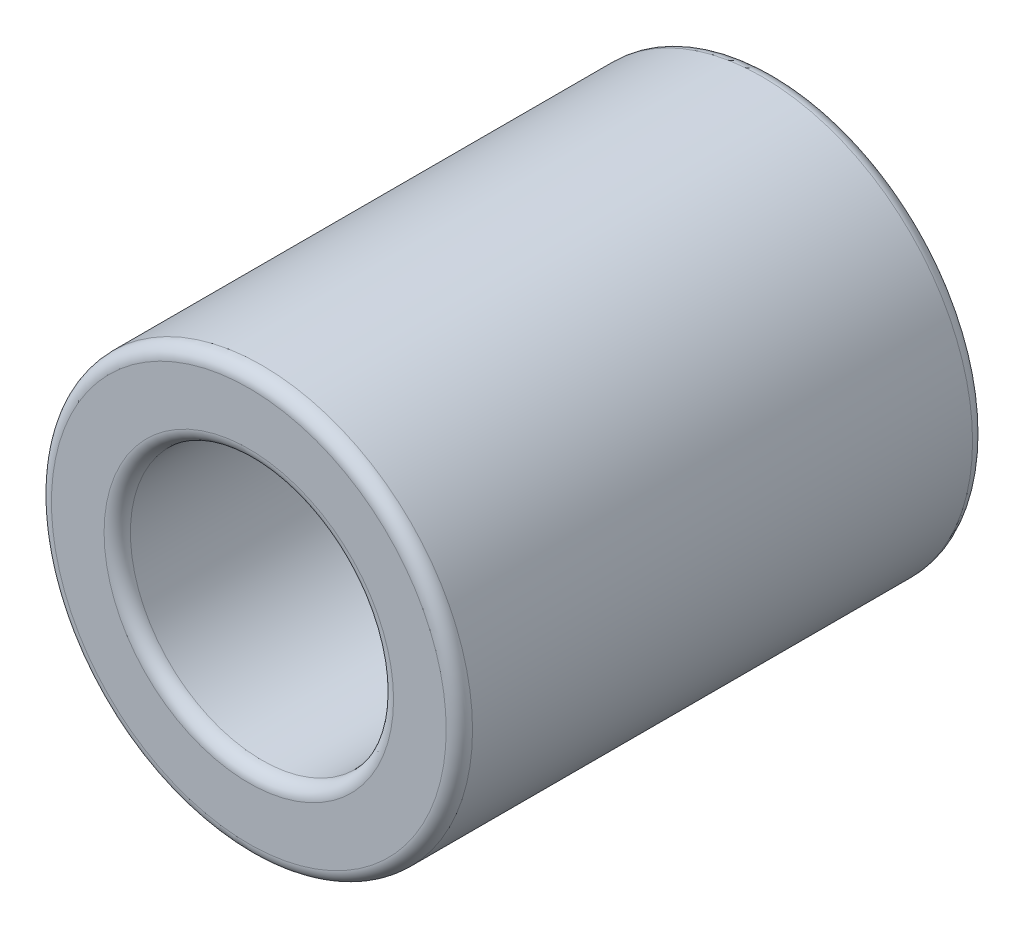
ISO-10303-21;
HEADER;
FILE_DESCRIPTION(('STEP AP214'),'2;1');
FILE_NAME('part.step','',(''),(''),'','','');
FILE_SCHEMA(('AUTOMOTIVE_DESIGN { 1 0 10303 214 1 1 1 1 }'));
ENDSEC;
DATA;
#1=APPLICATION_CONTEXT('core data for automotive mechanical design processes');
#2=APPLICATION_PROTOCOL_DEFINITION('international standard','automotive_design',2000,#1);
#3=PRODUCT_CONTEXT('',#1,'mechanical');
#4=PRODUCT('Part','Part','',(#3));
#5=PRODUCT_RELATED_PRODUCT_CATEGORY('part','',(#4));
#6=PRODUCT_DEFINITION_FORMATION('','',#4);
#7=PRODUCT_DEFINITION_CONTEXT('part definition',#1,'design');
#8=PRODUCT_DEFINITION('design','',#6,#7);
#9=PRODUCT_DEFINITION_SHAPE('','',#8);
#10=(LENGTH_UNIT() NAMED_UNIT(*) SI_UNIT(.MILLI.,.METRE.));
#11=(NAMED_UNIT(*) PLANE_ANGLE_UNIT() SI_UNIT($,.RADIAN.));
#12=(NAMED_UNIT(*) SI_UNIT($,.STERADIAN.) SOLID_ANGLE_UNIT());
#13=UNCERTAINTY_MEASURE_WITH_UNIT(LENGTH_MEASURE(1.E-05),#10,'distance_accuracy_value','');
#14=(GEOMETRIC_REPRESENTATION_CONTEXT(3) GLOBAL_UNCERTAINTY_ASSIGNED_CONTEXT((#13)) GLOBAL_UNIT_ASSIGNED_CONTEXT((#10,
#11,#12)) REPRESENTATION_CONTEXT('',''));
#15=CARTESIAN_POINT('',(0.,0.,0.));
#16=DIRECTION('',(0.,0.,1.));
#17=DIRECTION('',(1.,0.,0.));
#18=AXIS2_PLACEMENT_3D('',#15,#16,#17);
#19=CARTESIAN_POINT('',(0.,0.,10.));
#20=DIRECTION('',(0.,0.,-1.));
#21=DIRECTION('',(-1.,0.,0.));
#22=AXIS2_PLACEMENT_3D('',#19,#20,#21);
#23=CYLINDRICAL_SURFACE('',#22,2.5);
#24=CARTESIAN_POINT('',(0.,0.,0.25));
#25=DIRECTION('',(0.,0.,1.));
#26=DIRECTION('',(1.,0.,0.));
#27=AXIS2_PLACEMENT_3D('',#24,#25,#26);
#28=CIRCLE('',#27,2.5);
#29=CARTESIAN_POINT('',(2.5,0.,0.25));
#30=VERTEX_POINT('',#29);
#31=EDGE_CURVE('E59',#30,#30,#28,.F.);
#32=ORIENTED_EDGE('',*,*,#31,.T.);
#33=EDGE_LOOP('',(#32));
#34=FACE_BOUND('',#33,.T.);
#35=CARTESIAN_POINT('',(0.,0.,9.75));
#36=DIRECTION('',(0.,0.,1.));
#37=DIRECTION('',(1.,0.,0.));
#38=AXIS2_PLACEMENT_3D('',#35,#36,#37);
#39=CIRCLE('',#38,2.5);
#40=CARTESIAN_POINT('',(2.5,0.,9.75));
#41=VERTEX_POINT('',#40);
#42=EDGE_CURVE('E62',#41,#41,#39,.T.);
#43=ORIENTED_EDGE('',*,*,#42,.T.);
#44=EDGE_LOOP('',(#43));
#45=FACE_BOUND('',#44,.T.);
#46=ADVANCED_FACE('F39',(#34,#45),#23,.F.);
#47=CARTESIAN_POINT('',(0.,0.,10.));
#48=DIRECTION('',(0.,0.,-1.));
#49=DIRECTION('',(-1.,0.,0.));
#50=AXIS2_PLACEMENT_3D('',#47,#48,#49);
#51=CYLINDRICAL_SURFACE('',#50,4.);
#52=CARTESIAN_POINT('',(0.,0.,0.25));
#53=DIRECTION('',(0.,0.,1.));
#54=DIRECTION('',(1.,0.,0.));
#55=AXIS2_PLACEMENT_3D('',#52,#53,#54);
#56=CIRCLE('',#55,4.);
#57=CARTESIAN_POINT('',(4.,0.,0.25));
#58=VERTEX_POINT('',#57);
#59=EDGE_CURVE('E10',#58,#58,#56,.T.);
#60=ORIENTED_EDGE('',*,*,#59,.T.);
#61=EDGE_LOOP('',(#60));
#62=FACE_BOUND('',#61,.T.);
#63=CARTESIAN_POINT('',(0.,0.,9.75));
#64=DIRECTION('',(0.,0.,1.));
#65=DIRECTION('',(1.,0.,0.));
#66=AXIS2_PLACEMENT_3D('',#63,#64,#65);
#67=CIRCLE('',#66,4.);
#68=CARTESIAN_POINT('',(4.,0.,9.75));
#69=VERTEX_POINT('',#68);
#70=EDGE_CURVE('E46',#69,#69,#67,.F.);
#71=ORIENTED_EDGE('',*,*,#70,.T.);
#72=EDGE_LOOP('',(#71));
#73=FACE_BOUND('',#72,.T.);
#74=ADVANCED_FACE('F87',(#62,#73),#51,.T.);
#75=CARTESIAN_POINT('',(0.,0.,10.));
#76=DIRECTION('',(0.,0.,1.));
#77=DIRECTION('',(1.,0.,0.));
#78=AXIS2_PLACEMENT_3D('',#75,#76,#77);
#79=PLANE('',#78);
#80=CARTESIAN_POINT('',(0.,0.,10.));
#81=DIRECTION('',(0.,0.,1.));
#82=DIRECTION('',(1.,0.,0.));
#83=AXIS2_PLACEMENT_3D('',#80,#81,#82);
#84=CIRCLE('',#83,2.75);
#85=CARTESIAN_POINT('',(2.75,0.,10.));
#86=VERTEX_POINT('',#85);
#87=EDGE_CURVE('E50',#86,#86,#84,.F.);
#88=ORIENTED_EDGE('',*,*,#87,.T.);
#89=EDGE_LOOP('',(#88));
#90=FACE_BOUND('',#89,.T.);
#91=CARTESIAN_POINT('',(0.,0.,10.));
#92=DIRECTION('',(0.,0.,1.));
#93=DIRECTION('',(1.,0.,0.));
#94=AXIS2_PLACEMENT_3D('',#91,#92,#93);
#95=CIRCLE('',#94,3.75);
#96=CARTESIAN_POINT('',(3.75,0.,10.));
#97=VERTEX_POINT('',#96);
#98=EDGE_CURVE('E54',#97,#97,#95,.T.);
#99=ORIENTED_EDGE('',*,*,#98,.T.);
#100=EDGE_LOOP('',(#99));
#101=FACE_BOUND('',#100,.T.);
#102=ADVANCED_FACE('F93',(#90,#101),#79,.T.);
#103=CARTESIAN_POINT('',(0.,0.,0.));
#104=DIRECTION('',(0.,0.,1.));
#105=DIRECTION('',(1.,0.,0.));
#106=AXIS2_PLACEMENT_3D('',#103,#104,#105);
#107=PLANE('',#106);
#108=CARTESIAN_POINT('',(0.,0.,0.));
#109=DIRECTION('',(0.,0.,1.));
#110=DIRECTION('',(1.,0.,0.));
#111=AXIS2_PLACEMENT_3D('',#108,#109,#110);
#112=CIRCLE('',#111,2.75);
#113=CARTESIAN_POINT('',(2.75,0.,0.));
#114=VERTEX_POINT('',#113);
#115=EDGE_CURVE('E65',#114,#114,#112,.T.);
#116=ORIENTED_EDGE('',*,*,#115,.T.);
#117=EDGE_LOOP('',(#116));
#118=FACE_BOUND('',#117,.T.);
#119=CARTESIAN_POINT('',(0.,0.,0.));
#120=DIRECTION('',(0.,0.,1.));
#121=DIRECTION('',(1.,0.,0.));
#122=AXIS2_PLACEMENT_3D('',#119,#120,#121);
#123=CIRCLE('',#122,3.75);
#124=CARTESIAN_POINT('',(3.75,0.,0.));
#125=VERTEX_POINT('',#124);
#126=EDGE_CURVE('E68',#125,#125,#123,.F.);
#127=ORIENTED_EDGE('',*,*,#126,.T.);
#128=EDGE_LOOP('',(#127));
#129=FACE_BOUND('',#128,.T.);
#130=ADVANCED_FACE('F72',(#118,#129),#107,.F.);
#131=CARTESIAN_POINT('',(0.,0.,0.25));
#132=DIRECTION('',(0.,0.,1.));
#133=DIRECTION('',(1.,0.,0.));
#134=AXIS2_PLACEMENT_3D('',#131,#132,#133);
#135=TOROIDAL_SURFACE('',#134,2.75,0.25);
#136=ORIENTED_EDGE('',*,*,#31,.F.);
#137=EDGE_LOOP('',(#136));
#138=FACE_BOUND('',#137,.T.);
#139=ORIENTED_EDGE('',*,*,#115,.F.);
#140=EDGE_LOOP('',(#139));
#141=FACE_BOUND('',#140,.T.);
#142=ADVANCED_FACE('F83',(#138,#141),#135,.T.);
#143=CARTESIAN_POINT('',(0.,0.,9.75));
#144=DIRECTION('',(0.,0.,1.));
#145=DIRECTION('',(1.,0.,0.));
#146=AXIS2_PLACEMENT_3D('',#143,#144,#145);
#147=TOROIDAL_SURFACE('',#146,2.75,0.25);
#148=ORIENTED_EDGE('',*,*,#87,.F.);
#149=EDGE_LOOP('',(#148));
#150=FACE_BOUND('',#149,.T.);
#151=ORIENTED_EDGE('',*,*,#42,.F.);
#152=EDGE_LOOP('',(#151));
#153=FACE_BOUND('',#152,.T.);
#154=ADVANCED_FACE('F77',(#150,#153),#147,.T.);
#155=CARTESIAN_POINT('',(0.,0.,0.25));
#156=DIRECTION('',(0.,0.,1.));
#157=DIRECTION('',(1.,0.,0.));
#158=AXIS2_PLACEMENT_3D('',#155,#156,#157);
#159=TOROIDAL_SURFACE('',#158,3.75,0.25);
#160=ORIENTED_EDGE('',*,*,#126,.F.);
#161=EDGE_LOOP('',(#160));
#162=FACE_BOUND('',#161,.T.);
#163=ORIENTED_EDGE('',*,*,#59,.F.);
#164=EDGE_LOOP('',(#163));
#165=FACE_BOUND('',#164,.T.);
#166=ADVANCED_FACE('F74',(#162,#165),#159,.T.);
#167=CARTESIAN_POINT('',(0.,0.,9.75));
#168=DIRECTION('',(0.,0.,1.));
#169=DIRECTION('',(1.,0.,0.));
#170=AXIS2_PLACEMENT_3D('',#167,#168,#169);
#171=TOROIDAL_SURFACE('',#170,3.75,0.25);
#172=ORIENTED_EDGE('',*,*,#70,.F.);
#173=EDGE_LOOP('',(#172));
#174=FACE_BOUND('',#173,.T.);
#175=ORIENTED_EDGE('',*,*,#98,.F.);
#176=EDGE_LOOP('',(#175));
#177=FACE_BOUND('',#176,.T.);
#178=ADVANCED_FACE('F41',(#174,#177),#171,.T.);
#179=CLOSED_SHELL('',(#46,#74,#102,#130,#142,#154,#166,#178));
#180=MANIFOLD_SOLID_BREP('B2',#179);
#181=ADVANCED_BREP_SHAPE_REPRESENTATION('',(#18,#180),#14);
#182=SHAPE_DEFINITION_REPRESENTATION(#9,#181);
ENDSEC;
END-ISO-10303-21;
